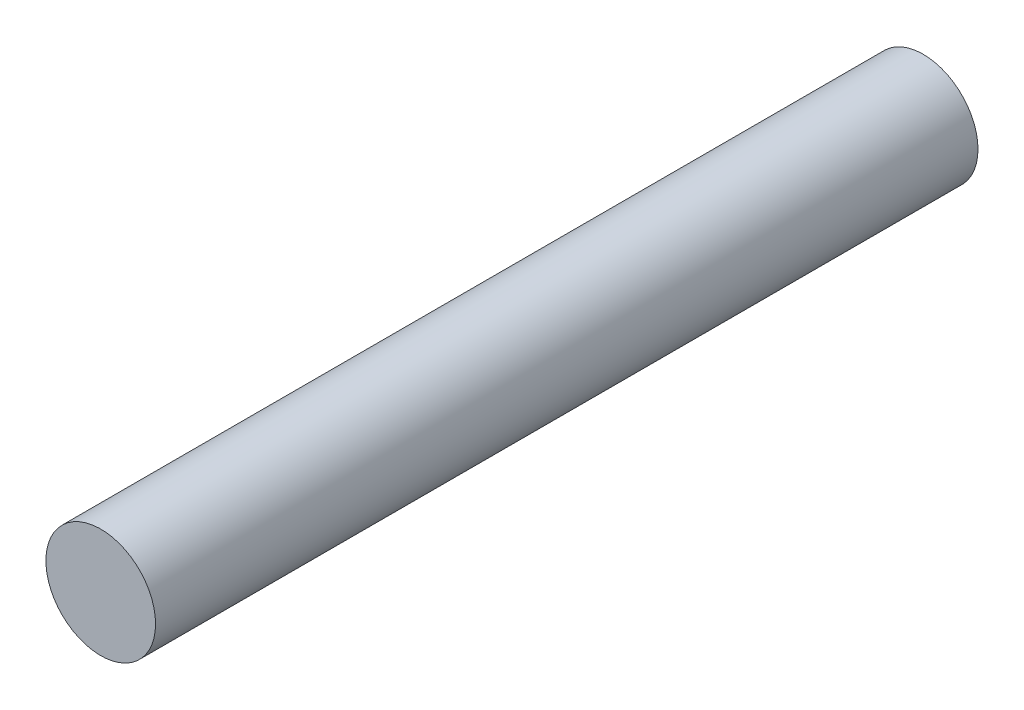
ISO-10303-21;
HEADER;
FILE_DESCRIPTION(('STEP AP214'),'2;1');
FILE_NAME('part.step','',(''),(''),'','','');
FILE_SCHEMA(('AUTOMOTIVE_DESIGN { 1 0 10303 214 1 1 1 1 }'));
ENDSEC;
DATA;
#1=APPLICATION_CONTEXT('core data for automotive mechanical design processes');
#2=APPLICATION_PROTOCOL_DEFINITION('international standard','automotive_design',2000,#1);
#3=PRODUCT_CONTEXT('',#1,'mechanical');
#4=PRODUCT('Part','Part','',(#3));
#5=PRODUCT_RELATED_PRODUCT_CATEGORY('part','',(#4));
#6=PRODUCT_DEFINITION_FORMATION('','',#4);
#7=PRODUCT_DEFINITION_CONTEXT('part definition',#1,'design');
#8=PRODUCT_DEFINITION('design','',#6,#7);
#9=PRODUCT_DEFINITION_SHAPE('','',#8);
#10=(LENGTH_UNIT() NAMED_UNIT(*) SI_UNIT(.MILLI.,.METRE.));
#11=(NAMED_UNIT(*) PLANE_ANGLE_UNIT() SI_UNIT($,.RADIAN.));
#12=(NAMED_UNIT(*) SI_UNIT($,.STERADIAN.) SOLID_ANGLE_UNIT());
#13=UNCERTAINTY_MEASURE_WITH_UNIT(LENGTH_MEASURE(1.E-05),#10,'distance_accuracy_value','');
#14=(GEOMETRIC_REPRESENTATION_CONTEXT(3) GLOBAL_UNCERTAINTY_ASSIGNED_CONTEXT((#13)) GLOBAL_UNIT_ASSIGNED_CONTEXT((#10,
#11,#12)) REPRESENTATION_CONTEXT('',''));
#15=CARTESIAN_POINT('',(0.,0.,0.));
#16=DIRECTION('',(0.,0.,1.));
#17=DIRECTION('',(1.,0.,0.));
#18=AXIS2_PLACEMENT_3D('',#15,#16,#17);
#19=CARTESIAN_POINT('',(0.,0.,60.));
#20=DIRECTION('',(0.,0.,-1.));
#21=DIRECTION('',(-1.,0.,0.));
#22=AXIS2_PLACEMENT_3D('',#19,#20,#21);
#23=CYLINDRICAL_SURFACE('',#22,4.);
#24=CARTESIAN_POINT('',(0.,0.,0.));
#25=DIRECTION('',(0.,0.,1.));
#26=DIRECTION('',(1.,0.,0.));
#27=AXIS2_PLACEMENT_3D('',#24,#25,#26);
#28=CIRCLE('',#27,4.);
#29=CARTESIAN_POINT('',(4.,0.,0.));
#30=VERTEX_POINT('',#29);
#31=EDGE_CURVE('E68',#30,#30,#28,.T.);
#32=ORIENTED_EDGE('',*,*,#31,.T.);
#33=EDGE_LOOP('',(#32));
#34=FACE_BOUND('',#33,.T.);
#35=CARTESIAN_POINT('',(0.,0.,60.));
#36=DIRECTION('',(0.,0.,1.));
#37=DIRECTION('',(1.,0.,0.));
#38=AXIS2_PLACEMENT_3D('',#35,#36,#37);
#39=CIRCLE('',#38,4.);
#40=CARTESIAN_POINT('',(4.,0.,60.));
#41=VERTEX_POINT('',#40);
#42=EDGE_CURVE('E71',#41,#41,#39,.T.);
#43=ORIENTED_EDGE('',*,*,#42,.F.);
#44=EDGE_LOOP('',(#43));
#45=FACE_BOUND('',#44,.T.);
#46=CARTESIAN_POINT('',(0.,0.,27.));
#47=DIRECTION('',(0.,0.,-1.));
#48=DIRECTION('',(-1.,0.,0.));
#49=AXIS2_PLACEMENT_3D('',#46,#47,#48);
#50=CIRCLE('',#49,4.);
#51=CARTESIAN_POINT('',(2.64575131106459,-3.,27.));
#52=VERTEX_POINT('',#51);
#53=CARTESIAN_POINT('',(-2.64575131106459,-3.,27.));
#54=VERTEX_POINT('',#53);
#55=EDGE_CURVE('E60',#52,#54,#50,.T.);
#56=ORIENTED_EDGE('',*,*,#55,.T.);
#57=DIRECTION('',(0.,0.,-1.));
#58=VECTOR('',#57,1.);
#59=CARTESIAN_POINT('',(-2.64575131106459,-3.,60.));
#60=LINE('',#59,#58);
#61=CARTESIAN_POINT('',(-2.64575131106459,-3.,33.));
#62=VERTEX_POINT('',#61);
#63=EDGE_CURVE('E11',#62,#54,#60,.T.);
#64=ORIENTED_EDGE('',*,*,#63,.F.);
#65=CARTESIAN_POINT('',(0.,0.,33.));
#66=DIRECTION('',(0.,0.,1.));
#67=DIRECTION('',(1.,0.,0.));
#68=AXIS2_PLACEMENT_3D('',#65,#66,#67);
#69=CIRCLE('',#68,4.);
#70=CARTESIAN_POINT('',(2.64575131106459,-3.,33.));
#71=VERTEX_POINT('',#70);
#72=EDGE_CURVE('E40',#62,#71,#69,.T.);
#73=ORIENTED_EDGE('',*,*,#72,.T.);
#74=DIRECTION('',(0.,0.,-1.));
#75=VECTOR('',#74,1.);
#76=CARTESIAN_POINT('',(2.64575131106459,-3.,60.));
#77=LINE('',#76,#75);
#78=EDGE_CURVE('E51',#52,#71,#77,.F.);
#79=ORIENTED_EDGE('',*,*,#78,.F.);
#80=EDGE_LOOP('',(#56,#64,#73,#79));
#81=FACE_BOUND('',#80,.T.);
#82=ADVANCED_FACE('F33',(#34,#45,#81),#23,.T.);
#83=CARTESIAN_POINT('',(0.,0.,60.));
#84=DIRECTION('',(0.,0.,1.));
#85=DIRECTION('',(1.,0.,0.));
#86=AXIS2_PLACEMENT_3D('',#83,#84,#85);
#87=PLANE('',#86);
#88=ORIENTED_EDGE('',*,*,#42,.T.);
#89=EDGE_LOOP('',(#88));
#90=FACE_BOUND('',#89,.T.);
#91=ADVANCED_FACE('F87',(#90),#87,.T.);
#92=CARTESIAN_POINT('',(0.,0.,0.));
#93=DIRECTION('',(0.,0.,1.));
#94=DIRECTION('',(1.,0.,0.));
#95=AXIS2_PLACEMENT_3D('',#92,#93,#94);
#96=PLANE('',#95);
#97=ORIENTED_EDGE('',*,*,#31,.F.);
#98=EDGE_LOOP('',(#97));
#99=FACE_BOUND('',#98,.T.);
#100=ADVANCED_FACE('F79',(#99),#96,.F.);
#101=CARTESIAN_POINT('',(-4.,-4.,33.));
#102=DIRECTION('',(0.,0.,1.));
#103=DIRECTION('',(1.,0.,0.));
#104=AXIS2_PLACEMENT_3D('',#101,#102,#103);
#105=PLANE('',#104);
#106=DIRECTION('',(1.,0.,0.));
#107=VECTOR('',#106,1.);
#108=CARTESIAN_POINT('',(-4.,-3.,33.));
#109=LINE('',#108,#107);
#110=EDGE_CURVE('E65',#62,#71,#109,.T.);
#111=ORIENTED_EDGE('',*,*,#110,.T.);
#112=ORIENTED_EDGE('',*,*,#72,.F.);
#113=EDGE_LOOP('',(#111,#112));
#114=FACE_BOUND('',#113,.T.);
#115=ADVANCED_FACE('F77',(#114),#105,.F.);
#116=CARTESIAN_POINT('',(-4.,-4.,27.));
#117=DIRECTION('',(0.,0.,-1.));
#118=DIRECTION('',(-1.,0.,0.));
#119=AXIS2_PLACEMENT_3D('',#116,#117,#118);
#120=PLANE('',#119);
#121=DIRECTION('',(-1.,0.,0.));
#122=VECTOR('',#121,1.);
#123=CARTESIAN_POINT('',(-4.,-3.,27.));
#124=LINE('',#123,#122);
#125=EDGE_CURVE('E46',#52,#54,#124,.T.);
#126=ORIENTED_EDGE('',*,*,#125,.T.);
#127=ORIENTED_EDGE('',*,*,#55,.F.);
#128=EDGE_LOOP('',(#126,#127));
#129=FACE_BOUND('',#128,.T.);
#130=ADVANCED_FACE('F66',(#129),#120,.F.);
#131=CARTESIAN_POINT('',(0.,-3.,0.));
#132=DIRECTION('',(0.,-1.,0.));
#133=DIRECTION('',(0.,0.,-1.));
#134=AXIS2_PLACEMENT_3D('',#131,#132,#133);
#135=PLANE('',#134);
#136=ORIENTED_EDGE('',*,*,#63,.T.);
#137=ORIENTED_EDGE('',*,*,#125,.F.);
#138=ORIENTED_EDGE('',*,*,#78,.T.);
#139=ORIENTED_EDGE('',*,*,#110,.F.);
#140=EDGE_LOOP('',(#136,#137,#138,#139));
#141=FACE_BOUND('',#140,.T.);
#142=ADVANCED_FACE('F64',(#141),#135,.T.);
#143=CLOSED_SHELL('',(#82,#91,#100,#115,#130,#142));
#144=MANIFOLD_SOLID_BREP('B2',#143);
#145=ADVANCED_BREP_SHAPE_REPRESENTATION('',(#18,#144),#14);
#146=SHAPE_DEFINITION_REPRESENTATION(#9,#145);
ENDSEC;
END-ISO-10303-21;
